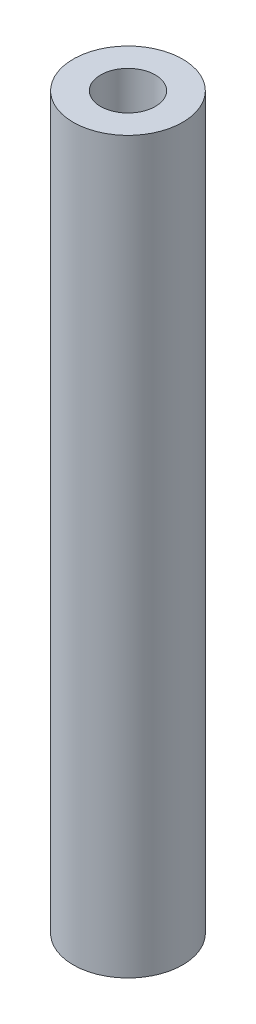
ISO-10303-21;
HEADER;
FILE_DESCRIPTION(('STEP AP214'),'2;1');
FILE_NAME('part.step','',(''),(''),'','','');
FILE_SCHEMA(('AUTOMOTIVE_DESIGN { 1 0 10303 214 1 1 1 1 }'));
ENDSEC;
DATA;
#1=APPLICATION_CONTEXT('core data for automotive mechanical design processes');
#2=APPLICATION_PROTOCOL_DEFINITION('international standard','automotive_design',2000,#1);
#3=PRODUCT_CONTEXT('',#1,'mechanical');
#4=PRODUCT('Part','Part','',(#3));
#5=PRODUCT_RELATED_PRODUCT_CATEGORY('part','',(#4));
#6=PRODUCT_DEFINITION_FORMATION('','',#4);
#7=PRODUCT_DEFINITION_CONTEXT('part definition',#1,'design');
#8=PRODUCT_DEFINITION('design','',#6,#7);
#9=PRODUCT_DEFINITION_SHAPE('','',#8);
#10=(LENGTH_UNIT() NAMED_UNIT(*) SI_UNIT(.MILLI.,.METRE.));
#11=(NAMED_UNIT(*) PLANE_ANGLE_UNIT() SI_UNIT($,.RADIAN.));
#12=(NAMED_UNIT(*) SI_UNIT($,.STERADIAN.) SOLID_ANGLE_UNIT());
#13=UNCERTAINTY_MEASURE_WITH_UNIT(LENGTH_MEASURE(1.E-05),#10,'distance_accuracy_value','');
#14=(GEOMETRIC_REPRESENTATION_CONTEXT(3) GLOBAL_UNCERTAINTY_ASSIGNED_CONTEXT((#13)) GLOBAL_UNIT_ASSIGNED_CONTEXT((#10,
#11,#12)) REPRESENTATION_CONTEXT('',''));
#15=CARTESIAN_POINT('',(0.,0.,0.));
#16=DIRECTION('',(0.,0.,1.));
#17=DIRECTION('',(1.,0.,0.));
#18=AXIS2_PLACEMENT_3D('',#15,#16,#17);
#19=CARTESIAN_POINT('',(0.,40.,0.));
#20=DIRECTION('',(0.,1.,0.));
#21=DIRECTION('',(0.,0.,1.));
#22=AXIS2_PLACEMENT_3D('',#19,#20,#21);
#23=PLANE('',#22);
#24=CARTESIAN_POINT('',(0.,40.,0.));
#25=DIRECTION('',(0.,1.,0.));
#26=DIRECTION('',(0.,0.,1.));
#27=AXIS2_PLACEMENT_3D('',#24,#25,#26);
#28=CIRCLE('',#27,3.);
#29=CARTESIAN_POINT('',(0.,40.,3.));
#30=VERTEX_POINT('',#29);
#31=EDGE_CURVE('E10',#30,#30,#28,.T.);
#32=ORIENTED_EDGE('',*,*,#31,.T.);
#33=EDGE_LOOP('',(#32));
#34=FACE_BOUND('',#33,.T.);
#35=CARTESIAN_POINT('',(0.,40.,0.));
#36=DIRECTION('',(0.,1.,0.));
#37=DIRECTION('',(0.,0.,1.));
#38=AXIS2_PLACEMENT_3D('',#35,#36,#37);
#39=CIRCLE('',#38,1.5);
#40=CARTESIAN_POINT('',(0.,40.,1.5));
#41=VERTEX_POINT('',#40);
#42=EDGE_CURVE('E44',#41,#41,#39,.T.);
#43=ORIENTED_EDGE('',*,*,#42,.F.);
#44=EDGE_LOOP('',(#43));
#45=FACE_BOUND('',#44,.T.);
#46=ADVANCED_FACE('F33',(#34,#45),#23,.T.);
#47=CARTESIAN_POINT('',(0.,0.,0.));
#48=DIRECTION('',(0.,1.,0.));
#49=DIRECTION('',(0.,0.,1.));
#50=AXIS2_PLACEMENT_3D('',#47,#48,#49);
#51=PLANE('',#50);
#52=CARTESIAN_POINT('',(0.,0.,0.));
#53=DIRECTION('',(0.,1.,0.));
#54=DIRECTION('',(0.,0.,1.));
#55=AXIS2_PLACEMENT_3D('',#52,#53,#54);
#56=CIRCLE('',#55,3.);
#57=CARTESIAN_POINT('',(0.,0.,3.));
#58=VERTEX_POINT('',#57);
#59=EDGE_CURVE('E37',#58,#58,#56,.T.);
#60=ORIENTED_EDGE('',*,*,#59,.F.);
#61=EDGE_LOOP('',(#60));
#62=FACE_BOUND('',#61,.T.);
#63=CARTESIAN_POINT('',(0.,0.,0.));
#64=DIRECTION('',(0.,1.,0.));
#65=DIRECTION('',(0.,0.,1.));
#66=AXIS2_PLACEMENT_3D('',#63,#64,#65);
#67=CIRCLE('',#66,1.5);
#68=CARTESIAN_POINT('',(0.,0.,1.5));
#69=VERTEX_POINT('',#68);
#70=EDGE_CURVE('E46',#69,#69,#67,.T.);
#71=ORIENTED_EDGE('',*,*,#70,.T.);
#72=EDGE_LOOP('',(#71));
#73=FACE_BOUND('',#72,.T.);
#74=ADVANCED_FACE('F56',(#62,#73),#51,.F.);
#75=CARTESIAN_POINT('',(0.,40.,0.));
#76=DIRECTION('',(0.,-1.,0.));
#77=DIRECTION('',(0.,0.,-1.));
#78=AXIS2_PLACEMENT_3D('',#75,#76,#77);
#79=CYLINDRICAL_SURFACE('',#78,3.);
#80=ORIENTED_EDGE('',*,*,#31,.F.);
#81=EDGE_LOOP('',(#80));
#82=FACE_BOUND('',#81,.T.);
#83=ORIENTED_EDGE('',*,*,#59,.T.);
#84=EDGE_LOOP('',(#83));
#85=FACE_BOUND('',#84,.T.);
#86=ADVANCED_FACE('F35',(#82,#85),#79,.T.);
#87=CARTESIAN_POINT('',(0.,40.,0.));
#88=DIRECTION('',(0.,-1.,0.));
#89=DIRECTION('',(0.,0.,-1.));
#90=AXIS2_PLACEMENT_3D('',#87,#88,#89);
#91=CYLINDRICAL_SURFACE('',#90,1.5);
#92=ORIENTED_EDGE('',*,*,#42,.T.);
#93=EDGE_LOOP('',(#92));
#94=FACE_BOUND('',#93,.T.);
#95=ORIENTED_EDGE('',*,*,#70,.F.);
#96=EDGE_LOOP('',(#95));
#97=FACE_BOUND('',#96,.T.);
#98=ADVANCED_FACE('F52',(#94,#97),#91,.F.);
#99=CLOSED_SHELL('',(#46,#74,#86,#98));
#100=MANIFOLD_SOLID_BREP('B2',#99);
#101=ADVANCED_BREP_SHAPE_REPRESENTATION('',(#18,#100),#14);
#102=SHAPE_DEFINITION_REPRESENTATION(#9,#101);
ENDSEC;
END-ISO-10303-21;
